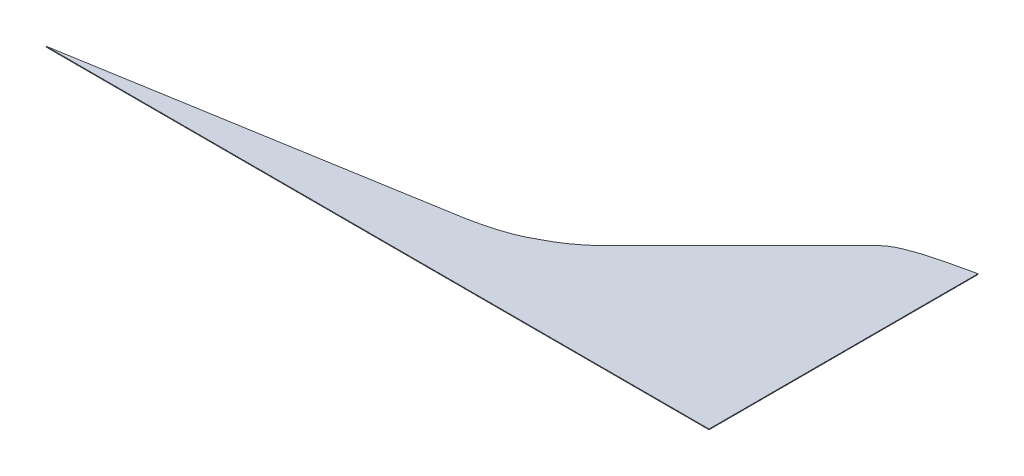
ISO-10303-21;
HEADER;
FILE_DESCRIPTION(('STEP AP214'),'2;1');
FILE_NAME('part.step','',(''),(''),'','','');
FILE_SCHEMA(('AUTOMOTIVE_DESIGN { 1 0 10303 214 1 1 1 1 }'));
ENDSEC;
DATA;
#1=APPLICATION_CONTEXT('core data for automotive mechanical design processes');
#2=APPLICATION_PROTOCOL_DEFINITION('international standard','automotive_design',2000,#1);
#3=PRODUCT_CONTEXT('',#1,'mechanical');
#4=PRODUCT('Part','Part','',(#3));
#5=PRODUCT_RELATED_PRODUCT_CATEGORY('part','',(#4));
#6=PRODUCT_DEFINITION_FORMATION('','',#4);
#7=PRODUCT_DEFINITION_CONTEXT('part definition',#1,'design');
#8=PRODUCT_DEFINITION('design','',#6,#7);
#9=PRODUCT_DEFINITION_SHAPE('','',#8);
#10=(LENGTH_UNIT() NAMED_UNIT(*) SI_UNIT(.MILLI.,.METRE.));
#11=(NAMED_UNIT(*) PLANE_ANGLE_UNIT() SI_UNIT($,.RADIAN.));
#12=(NAMED_UNIT(*) SI_UNIT($,.STERADIAN.) SOLID_ANGLE_UNIT());
#13=UNCERTAINTY_MEASURE_WITH_UNIT(LENGTH_MEASURE(1.E-05),#10,'distance_accuracy_value','');
#14=(GEOMETRIC_REPRESENTATION_CONTEXT(3) GLOBAL_UNCERTAINTY_ASSIGNED_CONTEXT((#13)) GLOBAL_UNIT_ASSIGNED_CONTEXT((#10,
#11,#12)) REPRESENTATION_CONTEXT('',''));
#15=CARTESIAN_POINT('',(0.,0.,0.));
#16=DIRECTION('',(0.,0.,1.));
#17=DIRECTION('',(1.,0.,0.));
#18=AXIS2_PLACEMENT_3D('',#15,#16,#17);
#19=CARTESIAN_POINT('',(-14923.5597137331,-14.2622567090821,2394.07260066972));
#20=DIRECTION('',(0.,0.,1.));
#21=DIRECTION('',(1.,0.,0.));
#22=AXIS2_PLACEMENT_3D('',#19,#20,#21);
#23=PLANE('',#22);
#24=DIRECTION('',(1.,0.,0.));
#25=VECTOR('',#24,1.);
#26=CARTESIAN_POINT('',(-14923.5597137331,11.1393276371552,2394.07260066972));
#27=LINE('',#26,#25);
#28=CARTESIAN_POINT('',(-14923.5597137331,11.1393276371552,2394.07260066972));
#29=VERTEX_POINT('',#28);
#30=CARTESIAN_POINT('',(8862.51301918743,11.1393276371552,2394.07260066972));
#31=VERTEX_POINT('',#30);
#32=EDGE_CURVE('E231',#29,#31,#27,.T.);
#33=ORIENTED_EDGE('',*,*,#32,.F.);
#34=DIRECTION('',(0.,1.,0.));
#35=VECTOR('',#34,1.);
#36=CARTESIAN_POINT('',(-14923.5597137331,-14.2622567090821,2394.07260066972));
#37=LINE('',#36,#35);
#38=CARTESIAN_POINT('',(-14923.5597137331,-14.2622567090821,2394.07260066972));
#39=VERTEX_POINT('',#38);
#40=EDGE_CURVE('E11',#39,#29,#37,.T.);
#41=ORIENTED_EDGE('',*,*,#40,.F.);
#42=DIRECTION('',(1.,0.,0.));
#43=VECTOR('',#42,1.);
#44=CARTESIAN_POINT('',(-14923.5597137331,-14.2622567090821,2394.07260066972));
#45=LINE('',#44,#43);
#46=CARTESIAN_POINT('',(8862.51301918743,-14.2622567090821,2394.07260066972));
#47=VERTEX_POINT('',#46);
#48=EDGE_CURVE('E207',#39,#47,#45,.T.);
#49=ORIENTED_EDGE('',*,*,#48,.T.);
#50=DIRECTION('',(0.,1.,0.));
#51=VECTOR('',#50,1.);
#52=CARTESIAN_POINT('',(8862.51301918743,-14.2622567090821,2394.07260066972));
#53=LINE('',#52,#51);
#54=EDGE_CURVE('E44',#47,#31,#53,.T.);
#55=ORIENTED_EDGE('',*,*,#54,.T.);
#56=EDGE_LOOP('',(#33,#41,#49,#55));
#57=FACE_BOUND('',#56,.T.);
#58=ADVANCED_FACE('F41',(#57),#23,.T.);
#59=CARTESIAN_POINT('',(-14923.5597137331,-14.2622567090821,2394.07260066972));
#60=DIRECTION('',(-0.166202382758003,0.,-0.986091663064627));
#61=DIRECTION('',(-0.986091663064627,0.,0.166202382758003));
#62=AXIS2_PLACEMENT_3D('',#59,#60,#61);
#63=PLANE('',#62);
#64=DIRECTION('',(-0.986091663064627,0.,0.166202382758003));
#65=VECTOR('',#64,1.);
#66=CARTESIAN_POINT('',(-14923.5597137331,11.1393276371552,2394.07260066972));
#67=LINE('',#66,#65);
#68=CARTESIAN_POINT('',(-2034.19377182768,11.1393276371552,221.613982444759));
#69=VERTEX_POINT('',#68);
#70=EDGE_CURVE('E208',#69,#29,#67,.T.);
#71=ORIENTED_EDGE('',*,*,#70,.F.);
#72=DIRECTION('',(0.,1.,0.));
#73=VECTOR('',#72,1.);
#74=CARTESIAN_POINT('',(-2034.19377182768,-14.2622567090821,221.613982444759));
#75=LINE('',#74,#73);
#76=CARTESIAN_POINT('',(-2034.19377182768,-14.2622567090821,221.613982444759));
#77=VERTEX_POINT('',#76);
#78=EDGE_CURVE('E50',#77,#69,#75,.T.);
#79=ORIENTED_EDGE('',*,*,#78,.F.);
#80=DIRECTION('',(-0.986091663064627,0.,0.166202382758003));
#81=VECTOR('',#80,1.);
#82=CARTESIAN_POINT('',(-14923.5597137331,-14.2622567090821,2394.07260066972));
#83=LINE('',#82,#81);
#84=EDGE_CURVE('E140',#77,#39,#83,.T.);
#85=ORIENTED_EDGE('',*,*,#84,.T.);
#86=ORIENTED_EDGE('',*,*,#40,.T.);
#87=EDGE_LOOP('',(#71,#79,#85,#86));
#88=FACE_BOUND('',#87,.T.);
#89=ADVANCED_FACE('F298',(#88),#63,.T.);
#90=CARTESIAN_POINT('',(-39.5402425524711,-14.2622567090821,-467.096852612952));
#91=CARTESIAN_POINT('',(-650.931022387214,-14.2622567090821,-96.0340768234382));
#92=CARTESIAN_POINT('',(-1341.88703957172,-14.2622567090821,78.3111173981127));
#93=CARTESIAN_POINT('',(-2034.19377182768,-14.2622567090821,221.613982444759));
#94=B_SPLINE_CURVE_WITH_KNOTS('',3,(#90,#91,#92,#93),.UNSPECIFIED.,.F.,.F.,(4,4),(0.,1.),.UNSPECIFIED.);
#95=DIRECTION('',(0.,1.,0.));
#96=VECTOR('',#95,1.);
#97=SURFACE_OF_LINEAR_EXTRUSION('',#94,#96);
#98=CARTESIAN_POINT('',(-39.5402425524711,11.1393276371552,-467.096852612952));
#99=CARTESIAN_POINT('',(-650.931022387214,11.1393276371552,-96.0340768234382));
#100=CARTESIAN_POINT('',(-1341.88703957172,11.1393276371552,78.3111173981127));
#101=CARTESIAN_POINT('',(-2034.19377182768,11.1393276371552,221.613982444759));
#102=B_SPLINE_CURVE_WITH_KNOTS('',3,(#98,#99,#100,#101),.UNSPECIFIED.,.F.,.F.,(4,4),(0.,1.),.UNSPECIFIED.);
#103=CARTESIAN_POINT('',(-39.5402425524711,11.1393276371552,-467.096852612952));
#104=VERTEX_POINT('',#103);
#105=EDGE_CURVE('E127',#104,#69,#102,.T.);
#106=ORIENTED_EDGE('',*,*,#105,.F.);
#107=DIRECTION('',(0.,1.,0.));
#108=VECTOR('',#107,1.);
#109=CARTESIAN_POINT('',(-39.5402425524711,-14.2622567090821,-467.096852612952));
#110=LINE('',#109,#108);
#111=CARTESIAN_POINT('',(-39.5402425524711,-14.2622567090821,-467.096852612952));
#112=VERTEX_POINT('',#111);
#113=EDGE_CURVE('E122',#112,#104,#110,.T.);
#114=ORIENTED_EDGE('',*,*,#113,.F.);
#115=EDGE_CURVE('E125',#112,#77,#94,.T.);
#116=ORIENTED_EDGE('',*,*,#115,.T.);
#117=ORIENTED_EDGE('',*,*,#78,.T.);
#118=EDGE_LOOP('',(#106,#114,#116,#117));
#119=FACE_BOUND('',#118,.T.);
#120=ADVANCED_FACE('F124',(#119),#97,.T.);
#121=CARTESIAN_POINT('',(1231.81156655243,-14.2622567090821,-1366.60167457773));
#122=CARTESIAN_POINT('',(654.307807437258,-14.2622567090821,-820.55967999158));
#123=CARTESIAN_POINT('',(-39.5402425524711,-14.2622567090821,-467.096852612952));
#124=B_SPLINE_CURVE_WITH_KNOTS('',2,(#121,#122,#123),.UNSPECIFIED.,.F.,.F.,(3,3),(0.,1.),.UNSPECIFIED.);
#125=DIRECTION('',(0.,1.,0.));
#126=VECTOR('',#125,1.);
#127=SURFACE_OF_LINEAR_EXTRUSION('',#124,#126);
#128=CARTESIAN_POINT('',(1231.81156655243,11.1393276371552,-1366.60167457773));
#129=CARTESIAN_POINT('',(654.307807437258,11.1393276371552,-820.55967999158));
#130=CARTESIAN_POINT('',(-39.5402425524711,11.1393276371552,-467.096852612952));
#131=B_SPLINE_CURVE_WITH_KNOTS('',2,(#128,#129,#130),.UNSPECIFIED.,.F.,.F.,(3,3),(0.,1.),.UNSPECIFIED.);
#132=CARTESIAN_POINT('',(1231.81156655243,11.1393276371552,-1366.60167457773));
#133=VERTEX_POINT('',#132);
#134=EDGE_CURVE('E213',#133,#104,#131,.T.);
#135=ORIENTED_EDGE('',*,*,#134,.F.);
#136=DIRECTION('',(0.,1.,0.));
#137=VECTOR('',#136,1.);
#138=CARTESIAN_POINT('',(1231.81156655243,-14.2622567090821,-1366.60167457773));
#139=LINE('',#138,#137);
#140=CARTESIAN_POINT('',(1231.81156655243,-14.2622567090821,-1366.60167457773));
#141=VERTEX_POINT('',#140);
#142=EDGE_CURVE('E132',#141,#133,#139,.T.);
#143=ORIENTED_EDGE('',*,*,#142,.F.);
#144=EDGE_CURVE('E138',#141,#112,#124,.T.);
#145=ORIENTED_EDGE('',*,*,#144,.T.);
#146=ORIENTED_EDGE('',*,*,#113,.T.);
#147=EDGE_LOOP('',(#135,#143,#145,#146));
#148=FACE_BOUND('',#147,.T.);
#149=ADVANCED_FACE('F142',(#148),#127,.T.);
#150=CARTESIAN_POINT('',(1231.81156655243,-14.2622567090821,-1366.60167457773));
#151=DIRECTION('',(-0.707106781186549,0.,-0.707106781186546));
#152=DIRECTION('',(-0.707106781186546,0.,0.707106781186549));
#153=AXIS2_PLACEMENT_3D('',#150,#151,#152);
#154=PLANE('',#153);
#155=DIRECTION('',(-0.707106781186546,0.,0.707106781186549));
#156=VECTOR('',#155,1.);
#157=CARTESIAN_POINT('',(1231.81156655243,11.1393276371552,-1366.60167457773));
#158=LINE('',#157,#156);
#159=CARTESIAN_POINT('',(6138.03662237969,11.1393276371552,-6272.82673040501));
#160=VERTEX_POINT('',#159);
#161=EDGE_CURVE('E265',#160,#133,#158,.T.);
#162=ORIENTED_EDGE('',*,*,#161,.F.);
#163=DIRECTION('',(0.,1.,0.));
#164=VECTOR('',#163,1.);
#165=CARTESIAN_POINT('',(6138.03662237969,-14.2622567090821,-6272.82673040501));
#166=LINE('',#165,#164);
#167=CARTESIAN_POINT('',(6138.03662237969,-14.2622567090821,-6272.82673040501));
#168=VERTEX_POINT('',#167);
#169=EDGE_CURVE('E221',#168,#160,#166,.T.);
#170=ORIENTED_EDGE('',*,*,#169,.F.);
#171=DIRECTION('',(-0.707106781186546,0.,0.707106781186549));
#172=VECTOR('',#171,1.);
#173=CARTESIAN_POINT('',(1231.81156655243,-14.2622567090821,-1366.60167457773));
#174=LINE('',#173,#172);
#175=EDGE_CURVE('E143',#168,#141,#174,.T.);
#176=ORIENTED_EDGE('',*,*,#175,.T.);
#177=ORIENTED_EDGE('',*,*,#142,.T.);
#178=EDGE_LOOP('',(#162,#170,#176,#177));
#179=FACE_BOUND('',#178,.T.);
#180=ADVANCED_FACE('F162',(#179),#154,.T.);
#181=CARTESIAN_POINT('',(6748.33576869227,-14.2622567090821,-6677.58415348115));
#182=CARTESIAN_POINT('',(6387.75391643603,-14.2622567090821,-6540.62269365027));
#183=CARTESIAN_POINT('',(6138.03662237969,-14.2622567090821,-6272.82673040501));
#184=B_SPLINE_CURVE_WITH_KNOTS('',2,(#181,#182,#183),.UNSPECIFIED.,.F.,.F.,(3,3),(0.,1.),.UNSPECIFIED.);
#185=DIRECTION('',(0.,1.,0.));
#186=VECTOR('',#185,1.);
#187=SURFACE_OF_LINEAR_EXTRUSION('',#184,#186);
#188=CARTESIAN_POINT('',(6748.33576869227,11.1393276371552,-6677.58415348115));
#189=CARTESIAN_POINT('',(6387.75391643603,11.1393276371552,-6540.62269365027));
#190=CARTESIAN_POINT('',(6138.03662237969,11.1393276371552,-6272.82673040501));
#191=B_SPLINE_CURVE_WITH_KNOTS('',2,(#188,#189,#190),.UNSPECIFIED.,.F.,.F.,(3,3),(0.,1.),.UNSPECIFIED.);
#192=CARTESIAN_POINT('',(6748.33576869227,11.1393276371552,-6677.58415348115));
#193=VERTEX_POINT('',#192);
#194=EDGE_CURVE('E257',#193,#160,#191,.T.);
#195=ORIENTED_EDGE('',*,*,#194,.F.);
#196=DIRECTION('',(0.,1.,0.));
#197=VECTOR('',#196,1.);
#198=CARTESIAN_POINT('',(6748.33576869227,-14.2622567090821,-6677.58415348115));
#199=LINE('',#198,#197);
#200=CARTESIAN_POINT('',(6748.33576869227,-14.2622567090821,-6677.58415348115));
#201=VERTEX_POINT('',#200);
#202=EDGE_CURVE('E223',#201,#193,#199,.T.);
#203=ORIENTED_EDGE('',*,*,#202,.F.);
#204=EDGE_CURVE('E145',#201,#168,#184,.T.);
#205=ORIENTED_EDGE('',*,*,#204,.T.);
#206=ORIENTED_EDGE('',*,*,#169,.T.);
#207=EDGE_LOOP('',(#195,#203,#205,#206));
#208=FACE_BOUND('',#207,.T.);
#209=ADVANCED_FACE('F166',(#208),#187,.T.);
#210=CARTESIAN_POINT('',(7248.25571324913,-14.2622567090821,-6861.94305323395));
#211=DIRECTION('',(-0.345999263214468,0.,-0.938234783972032));
#212=DIRECTION('',(-0.938234783972032,0.,0.345999263214468));
#213=AXIS2_PLACEMENT_3D('',#210,#211,#212);
#214=PLANE('',#213);
#215=CARTESIAN_POINT('',(7248.25571324913,11.1393276371552,-6861.94305323395));
#216=CARTESIAN_POINT('',(6748.33576869227,11.1393276371552,-6677.58415348115));
#217=B_SPLINE_CURVE_WITH_KNOTS('',1,(#215,#216),.UNSPECIFIED.,.F.,.F.,(2,2),(0.,1.),.UNSPECIFIED.);
#218=CARTESIAN_POINT('',(7248.25571324913,11.1393276371552,-6861.94305323395));
#219=VERTEX_POINT('',#218);
#220=EDGE_CURVE('E249',#219,#193,#217,.T.);
#221=ORIENTED_EDGE('',*,*,#220,.F.);
#222=DIRECTION('',(0.,1.,0.));
#223=VECTOR('',#222,1.);
#224=CARTESIAN_POINT('',(7248.25571324913,-14.2622567090821,-6861.94305323395));
#225=LINE('',#224,#223);
#226=CARTESIAN_POINT('',(7248.25571324913,-14.2622567090821,-6861.94305323395));
#227=VERTEX_POINT('',#226);
#228=EDGE_CURVE('E225',#227,#219,#225,.T.);
#229=ORIENTED_EDGE('',*,*,#228,.F.);
#230=CARTESIAN_POINT('',(7248.25571324913,-14.2622567090821,-6861.94305323395));
#231=CARTESIAN_POINT('',(6748.33576869227,-14.2622567090821,-6677.58415348115));
#232=B_SPLINE_CURVE_WITH_KNOTS('',1,(#230,#231),.UNSPECIFIED.,.F.,.F.,(2,2),(0.,1.),.UNSPECIFIED.);
#233=EDGE_CURVE('E178',#227,#201,#232,.T.);
#234=ORIENTED_EDGE('',*,*,#233,.T.);
#235=ORIENTED_EDGE('',*,*,#202,.T.);
#236=EDGE_LOOP('',(#221,#229,#234,#235));
#237=FACE_BOUND('',#236,.T.);
#238=ADVANCED_FACE('F170',(#237),#214,.T.);
#239=CARTESIAN_POINT('',(7827.99371542156,-14.2622567090821,-7017.7614876143));
#240=DIRECTION('',(-0.259562044251415,0.,-0.965726433926309));
#241=DIRECTION('',(-0.965726433926309,0.,0.259562044251415));
#242=AXIS2_PLACEMENT_3D('',#239,#240,#241);
#243=PLANE('',#242);
#244=CARTESIAN_POINT('',(7827.99371542156,11.1393276371552,-7017.7614876143));
#245=CARTESIAN_POINT('',(7248.25571324913,11.1393276371552,-6861.94305323395));
#246=B_SPLINE_CURVE_WITH_KNOTS('',1,(#244,#245),.UNSPECIFIED.,.F.,.F.,(2,2),(0.,1.),.UNSPECIFIED.);
#247=CARTESIAN_POINT('',(7827.99371542156,11.1393276371552,-7017.7614876143));
#248=VERTEX_POINT('',#247);
#249=EDGE_CURVE('E241',#248,#219,#246,.T.);
#250=ORIENTED_EDGE('',*,*,#249,.F.);
#251=DIRECTION('',(0.,1.,0.));
#252=VECTOR('',#251,1.);
#253=CARTESIAN_POINT('',(7827.99371542156,-14.2622567090821,-7017.7614876143));
#254=LINE('',#253,#252);
#255=CARTESIAN_POINT('',(7827.99371542156,-14.2622567090821,-7017.7614876143));
#256=VERTEX_POINT('',#255);
#257=EDGE_CURVE('E227',#256,#248,#254,.T.);
#258=ORIENTED_EDGE('',*,*,#257,.F.);
#259=CARTESIAN_POINT('',(7827.99371542156,-14.2622567090821,-7017.7614876143));
#260=CARTESIAN_POINT('',(7248.25571324913,-14.2622567090821,-6861.94305323395));
#261=B_SPLINE_CURVE_WITH_KNOTS('',1,(#259,#260),.UNSPECIFIED.,.F.,.F.,(2,2),(0.,1.),.UNSPECIFIED.);
#262=EDGE_CURVE('E186',#256,#227,#261,.T.);
#263=ORIENTED_EDGE('',*,*,#262,.T.);
#264=ORIENTED_EDGE('',*,*,#228,.T.);
#265=EDGE_LOOP('',(#250,#258,#263,#264));
#266=FACE_BOUND('',#265,.T.);
#267=ADVANCED_FACE('F286',(#266),#243,.T.);
#268=CARTESIAN_POINT('',(8862.51301918743,-14.2622567090821,-7253.63250525811));
#269=DIRECTION('',(-0.222295851819923,0.,-0.974979258376123));
#270=DIRECTION('',(-0.974979258376123,0.,0.222295851819923));
#271=AXIS2_PLACEMENT_3D('',#268,#269,#270);
#272=PLANE('',#271);
#273=CARTESIAN_POINT('',(8862.51301918743,11.1393276371552,-7253.63250525811));
#274=CARTESIAN_POINT('',(7827.99371542156,11.1393276371552,-7017.7614876143));
#275=B_SPLINE_CURVE_WITH_KNOTS('',1,(#273,#274),.UNSPECIFIED.,.F.,.F.,(2,2),(0.,1.),.UNSPECIFIED.);
#276=CARTESIAN_POINT('',(8862.51301918743,11.1393276371552,-7253.63250525811));
#277=VERTEX_POINT('',#276);
#278=EDGE_CURVE('E236',#277,#248,#275,.T.);
#279=ORIENTED_EDGE('',*,*,#278,.F.);
#280=DIRECTION('',(0.,1.,0.));
#281=VECTOR('',#280,1.);
#282=CARTESIAN_POINT('',(8862.51301918743,-14.2622567090821,-7253.63250525811));
#283=LINE('',#282,#281);
#284=CARTESIAN_POINT('',(8862.51301918743,-14.2622567090821,-7253.63250525811));
#285=VERTEX_POINT('',#284);
#286=EDGE_CURVE('E228',#285,#277,#283,.T.);
#287=ORIENTED_EDGE('',*,*,#286,.F.);
#288=CARTESIAN_POINT('',(8862.51301918743,-14.2622567090821,-7253.63250525811));
#289=CARTESIAN_POINT('',(7827.99371542156,-14.2622567090821,-7017.7614876143));
#290=B_SPLINE_CURVE_WITH_KNOTS('',1,(#288,#289),.UNSPECIFIED.,.F.,.F.,(2,2),(0.,1.),.UNSPECIFIED.);
#291=EDGE_CURVE('E194',#285,#256,#290,.T.);
#292=ORIENTED_EDGE('',*,*,#291,.T.);
#293=ORIENTED_EDGE('',*,*,#257,.T.);
#294=EDGE_LOOP('',(#279,#287,#292,#293));
#295=FACE_BOUND('',#294,.T.);
#296=ADVANCED_FACE('F288',(#295),#272,.T.);
#297=CARTESIAN_POINT('',(8862.51301918743,-14.2622567090821,2394.07260066972));
#298=DIRECTION('',(1.,0.,0.));
#299=DIRECTION('',(0.,0.,-1.));
#300=AXIS2_PLACEMENT_3D('',#297,#298,#299);
#301=PLANE('',#300);
#302=DIRECTION('',(0.,0.,-1.));
#303=VECTOR('',#302,1.);
#304=CARTESIAN_POINT('',(8862.51301918743,11.1393276371552,2394.07260066972));
#305=LINE('',#304,#303);
#306=EDGE_CURVE('E233',#31,#277,#305,.T.);
#307=ORIENTED_EDGE('',*,*,#306,.F.);
#308=ORIENTED_EDGE('',*,*,#54,.F.);
#309=DIRECTION('',(0.,0.,-1.));
#310=VECTOR('',#309,1.);
#311=CARTESIAN_POINT('',(8862.51301918743,-14.2622567090821,2394.07260066972));
#312=LINE('',#311,#310);
#313=EDGE_CURVE('E202',#47,#285,#312,.T.);
#314=ORIENTED_EDGE('',*,*,#313,.T.);
#315=ORIENTED_EDGE('',*,*,#286,.T.);
#316=EDGE_LOOP('',(#307,#308,#314,#315));
#317=FACE_BOUND('',#316,.T.);
#318=ADVANCED_FACE('F289',(#317),#301,.T.);
#319=CARTESIAN_POINT('',(6415.47005598601,-14.2622567090821,-6507.91406779668));
#320=DIRECTION('',(0.,1.,0.));
#321=DIRECTION('',(0.,0.,1.));
#322=AXIS2_PLACEMENT_3D('',#319,#320,#321);
#323=PLANE('',#322);
#324=ORIENTED_EDGE('',*,*,#48,.F.);
#325=ORIENTED_EDGE('',*,*,#84,.F.);
#326=ORIENTED_EDGE('',*,*,#115,.F.);
#327=ORIENTED_EDGE('',*,*,#144,.F.);
#328=ORIENTED_EDGE('',*,*,#175,.F.);
#329=ORIENTED_EDGE('',*,*,#204,.F.);
#330=ORIENTED_EDGE('',*,*,#233,.F.);
#331=ORIENTED_EDGE('',*,*,#262,.F.);
#332=ORIENTED_EDGE('',*,*,#291,.F.);
#333=ORIENTED_EDGE('',*,*,#313,.F.);
#334=EDGE_LOOP('',(#324,#325,#326,#327,#328,#329,#330,#331,#332,#333));
#335=FACE_BOUND('',#334,.T.);
#336=ADVANCED_FACE('F136',(#335),#323,.F.);
#337=CARTESIAN_POINT('',(6415.47005598601,11.1393276371552,-6507.91406779668));
#338=DIRECTION('',(0.,1.,0.));
#339=DIRECTION('',(0.,0.,1.));
#340=AXIS2_PLACEMENT_3D('',#337,#338,#339);
#341=PLANE('',#340);
#342=ORIENTED_EDGE('',*,*,#32,.T.);
#343=ORIENTED_EDGE('',*,*,#306,.T.);
#344=ORIENTED_EDGE('',*,*,#278,.T.);
#345=ORIENTED_EDGE('',*,*,#249,.T.);
#346=ORIENTED_EDGE('',*,*,#220,.T.);
#347=ORIENTED_EDGE('',*,*,#194,.T.);
#348=ORIENTED_EDGE('',*,*,#161,.T.);
#349=ORIENTED_EDGE('',*,*,#134,.T.);
#350=ORIENTED_EDGE('',*,*,#105,.T.);
#351=ORIENTED_EDGE('',*,*,#70,.T.);
#352=EDGE_LOOP('',(#342,#343,#344,#345,#346,#347,#348,#349,#350,#351));
#353=FACE_BOUND('',#352,.T.);
#354=ADVANCED_FACE('F275',(#353),#341,.T.);
#355=CLOSED_SHELL('',(#58,#89,#120,#149,#180,#209,#238,#267,#296,#318,#336,#354));
#356=MANIFOLD_SOLID_BREP('B2',#355);
#357=ADVANCED_BREP_SHAPE_REPRESENTATION('',(#18,#356),#14);
#358=SHAPE_DEFINITION_REPRESENTATION(#9,#357);
ENDSEC;
END-ISO-10303-21;
